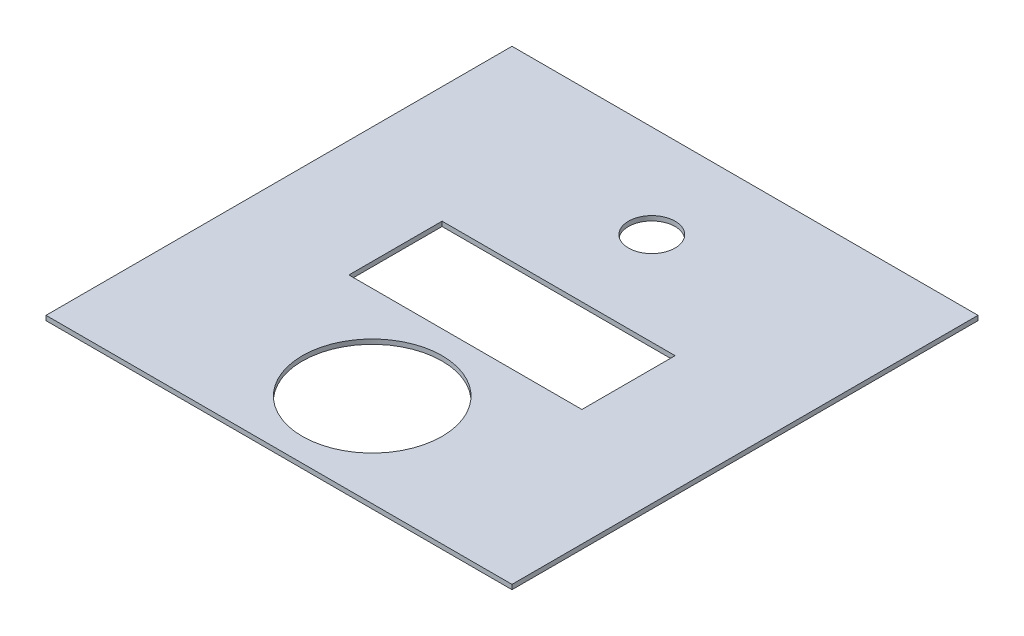
ISO-10303-21;
HEADER;
FILE_DESCRIPTION(('STEP AP214'),'2;1');
FILE_NAME('part.step','',(''),(''),'','','');
FILE_SCHEMA(('AUTOMOTIVE_DESIGN { 1 0 10303 214 1 1 1 1 }'));
ENDSEC;
DATA;
#1=APPLICATION_CONTEXT('core data for automotive mechanical design processes');
#2=APPLICATION_PROTOCOL_DEFINITION('international standard','automotive_design',2000,#1);
#3=PRODUCT_CONTEXT('',#1,'mechanical');
#4=PRODUCT('Part','Part','',(#3));
#5=PRODUCT_RELATED_PRODUCT_CATEGORY('part','',(#4));
#6=PRODUCT_DEFINITION_FORMATION('','',#4);
#7=PRODUCT_DEFINITION_CONTEXT('part definition',#1,'design');
#8=PRODUCT_DEFINITION('design','',#6,#7);
#9=PRODUCT_DEFINITION_SHAPE('','',#8);
#10=(LENGTH_UNIT() NAMED_UNIT(*) SI_UNIT(.MILLI.,.METRE.));
#11=(NAMED_UNIT(*) PLANE_ANGLE_UNIT() SI_UNIT($,.RADIAN.));
#12=(NAMED_UNIT(*) SI_UNIT($,.STERADIAN.) SOLID_ANGLE_UNIT());
#13=UNCERTAINTY_MEASURE_WITH_UNIT(LENGTH_MEASURE(1.E-05),#10,'distance_accuracy_value','');
#14=(GEOMETRIC_REPRESENTATION_CONTEXT(3) GLOBAL_UNCERTAINTY_ASSIGNED_CONTEXT((#13)) GLOBAL_UNIT_ASSIGNED_CONTEXT((#10,
#11,#12)) REPRESENTATION_CONTEXT('',''));
#15=CARTESIAN_POINT('',(0.,0.,0.));
#16=DIRECTION('',(0.,0.,1.));
#17=DIRECTION('',(1.,0.,0.));
#18=AXIS2_PLACEMENT_3D('',#15,#16,#17);
#19=CARTESIAN_POINT('',(50.,1.,50.));
#20=DIRECTION('',(-1.,0.,0.));
#21=DIRECTION('',(0.,0.,1.));
#22=AXIS2_PLACEMENT_3D('',#19,#20,#21);
#23=PLANE('',#22);
#24=DIRECTION('',(0.,0.,-1.));
#25=VECTOR('',#24,1.);
#26=CARTESIAN_POINT('',(50.,0.,50.));
#27=LINE('',#26,#25);
#28=CARTESIAN_POINT('',(50.,0.,50.));
#29=VERTEX_POINT('',#28);
#30=CARTESIAN_POINT('',(50.,0.,-50.));
#31=VERTEX_POINT('',#30);
#32=EDGE_CURVE('E134',#29,#31,#27,.T.);
#33=ORIENTED_EDGE('',*,*,#32,.T.);
#34=DIRECTION('',(0.,-1.,0.));
#35=VECTOR('',#34,1.);
#36=CARTESIAN_POINT('',(50.,1.,-50.));
#37=LINE('',#36,#35);
#38=CARTESIAN_POINT('',(50.,1.,-50.));
#39=VERTEX_POINT('',#38);
#40=EDGE_CURVE('E11',#39,#31,#37,.T.);
#41=ORIENTED_EDGE('',*,*,#40,.F.);
#42=DIRECTION('',(0.,0.,-1.));
#43=VECTOR('',#42,1.);
#44=CARTESIAN_POINT('',(50.,1.,50.));
#45=LINE('',#44,#43);
#46=CARTESIAN_POINT('',(50.,1.,50.));
#47=VERTEX_POINT('',#46);
#48=EDGE_CURVE('E138',#47,#39,#45,.T.);
#49=ORIENTED_EDGE('',*,*,#48,.F.);
#50=DIRECTION('',(0.,-1.,0.));
#51=VECTOR('',#50,1.);
#52=CARTESIAN_POINT('',(50.,1.,50.));
#53=LINE('',#52,#51);
#54=EDGE_CURVE('E148',#47,#29,#53,.T.);
#55=ORIENTED_EDGE('',*,*,#54,.T.);
#56=EDGE_LOOP('',(#33,#41,#49,#55));
#57=FACE_BOUND('',#56,.T.);
#58=ADVANCED_FACE('F33',(#57),#23,.F.);
#59=CARTESIAN_POINT('',(-50.,1.,-50.));
#60=DIRECTION('',(0.,0.,1.));
#61=DIRECTION('',(1.,0.,0.));
#62=AXIS2_PLACEMENT_3D('',#59,#60,#61);
#63=PLANE('',#62);
#64=DIRECTION('',(-1.,0.,0.));
#65=VECTOR('',#64,1.);
#66=CARTESIAN_POINT('',(-50.,0.,-50.));
#67=LINE('',#66,#65);
#68=CARTESIAN_POINT('',(-50.,0.,-50.));
#69=VERTEX_POINT('',#68);
#70=EDGE_CURVE('E151',#31,#69,#67,.T.);
#71=ORIENTED_EDGE('',*,*,#70,.T.);
#72=DIRECTION('',(0.,-1.,0.));
#73=VECTOR('',#72,1.);
#74=CARTESIAN_POINT('',(-50.,1.,-50.));
#75=LINE('',#74,#73);
#76=CARTESIAN_POINT('',(-50.,1.,-50.));
#77=VERTEX_POINT('',#76);
#78=EDGE_CURVE('E40',#77,#69,#75,.T.);
#79=ORIENTED_EDGE('',*,*,#78,.F.);
#80=DIRECTION('',(-1.,0.,0.));
#81=VECTOR('',#80,1.);
#82=CARTESIAN_POINT('',(-50.,1.,-50.));
#83=LINE('',#82,#81);
#84=EDGE_CURVE('E141',#39,#77,#83,.T.);
#85=ORIENTED_EDGE('',*,*,#84,.F.);
#86=ORIENTED_EDGE('',*,*,#40,.T.);
#87=EDGE_LOOP('',(#71,#79,#85,#86));
#88=FACE_BOUND('',#87,.T.);
#89=ADVANCED_FACE('F179',(#88),#63,.F.);
#90=CARTESIAN_POINT('',(-50.,1.,50.));
#91=DIRECTION('',(1.,0.,0.));
#92=DIRECTION('',(0.,0.,-1.));
#93=AXIS2_PLACEMENT_3D('',#90,#91,#92);
#94=PLANE('',#93);
#95=DIRECTION('',(0.,0.,1.));
#96=VECTOR('',#95,1.);
#97=CARTESIAN_POINT('',(-50.,0.,50.));
#98=LINE('',#97,#96);
#99=CARTESIAN_POINT('',(-50.,0.,50.));
#100=VERTEX_POINT('',#99);
#101=EDGE_CURVE('E153',#69,#100,#98,.T.);
#102=ORIENTED_EDGE('',*,*,#101,.T.);
#103=DIRECTION('',(0.,-1.,0.));
#104=VECTOR('',#103,1.);
#105=CARTESIAN_POINT('',(-50.,1.,50.));
#106=LINE('',#105,#104);
#107=CARTESIAN_POINT('',(-50.,1.,50.));
#108=VERTEX_POINT('',#107);
#109=EDGE_CURVE('E158',#108,#100,#106,.T.);
#110=ORIENTED_EDGE('',*,*,#109,.F.);
#111=DIRECTION('',(0.,0.,1.));
#112=VECTOR('',#111,1.);
#113=CARTESIAN_POINT('',(-50.,1.,50.));
#114=LINE('',#113,#112);
#115=EDGE_CURVE('E144',#77,#108,#114,.T.);
#116=ORIENTED_EDGE('',*,*,#115,.F.);
#117=ORIENTED_EDGE('',*,*,#78,.T.);
#118=EDGE_LOOP('',(#102,#110,#116,#117));
#119=FACE_BOUND('',#118,.T.);
#120=ADVANCED_FACE('F165',(#119),#94,.F.);
#121=CARTESIAN_POINT('',(-50.,1.,50.));
#122=DIRECTION('',(0.,0.,-1.));
#123=DIRECTION('',(-1.,0.,0.));
#124=AXIS2_PLACEMENT_3D('',#121,#122,#123);
#125=PLANE('',#124);
#126=DIRECTION('',(1.,0.,0.));
#127=VECTOR('',#126,1.);
#128=CARTESIAN_POINT('',(-50.,0.,50.));
#129=LINE('',#128,#127);
#130=EDGE_CURVE('E142',#100,#29,#129,.T.);
#131=ORIENTED_EDGE('',*,*,#130,.T.);
#132=ORIENTED_EDGE('',*,*,#54,.F.);
#133=DIRECTION('',(1.,0.,0.));
#134=VECTOR('',#133,1.);
#135=CARTESIAN_POINT('',(-50.,1.,50.));
#136=LINE('',#135,#134);
#137=EDGE_CURVE('E146',#108,#47,#136,.T.);
#138=ORIENTED_EDGE('',*,*,#137,.F.);
#139=ORIENTED_EDGE('',*,*,#109,.T.);
#140=EDGE_LOOP('',(#131,#132,#138,#139));
#141=FACE_BOUND('',#140,.T.);
#142=ADVANCED_FACE('F172',(#141),#125,.F.);
#143=CARTESIAN_POINT('',(0.,1.,0.));
#144=DIRECTION('',(0.,-1.,0.));
#145=DIRECTION('',(0.,0.,-1.));
#146=AXIS2_PLACEMENT_3D('',#143,#144,#145);
#147=PLANE('',#146);
#148=CARTESIAN_POINT('',(0.,1.,-30.));
#149=DIRECTION('',(0.,1.,0.));
#150=DIRECTION('',(0.,0.,1.));
#151=AXIS2_PLACEMENT_3D('',#148,#149,#150);
#152=CIRCLE('',#151,5.);
#153=CARTESIAN_POINT('',(0.,1.,-25.));
#154=VERTEX_POINT('',#153);
#155=EDGE_CURVE('E220',#154,#154,#152,.T.);
#156=ORIENTED_EDGE('',*,*,#155,.F.);
#157=EDGE_LOOP('',(#156));
#158=FACE_BOUND('',#157,.T.);
#159=CARTESIAN_POINT('',(0.,1.,30.));
#160=DIRECTION('',(0.,1.,0.));
#161=DIRECTION('',(0.,0.,1.));
#162=AXIS2_PLACEMENT_3D('',#159,#160,#161);
#163=CIRCLE('',#162,15.);
#164=CARTESIAN_POINT('',(0.,1.,45.));
#165=VERTEX_POINT('',#164);
#166=EDGE_CURVE('E121',#165,#165,#163,.T.);
#167=ORIENTED_EDGE('',*,*,#166,.F.);
#168=EDGE_LOOP('',(#167));
#169=FACE_BOUND('',#168,.T.);
#170=DIRECTION('',(-1.,0.,0.));
#171=VECTOR('',#170,1.);
#172=CARTESIAN_POINT('',(-25.,1.,-10.));
#173=LINE('',#172,#171);
#174=CARTESIAN_POINT('',(25.,1.,-10.));
#175=VERTEX_POINT('',#174);
#176=CARTESIAN_POINT('',(-25.,1.,-10.));
#177=VERTEX_POINT('',#176);
#178=EDGE_CURVE('E127',#175,#177,#173,.T.);
#179=ORIENTED_EDGE('',*,*,#178,.F.);
#180=DIRECTION('',(0.,0.,-1.));
#181=VECTOR('',#180,1.);
#182=CARTESIAN_POINT('',(25.,1.,10.));
#183=LINE('',#182,#181);
#184=CARTESIAN_POINT('',(25.,1.,10.));
#185=VERTEX_POINT('',#184);
#186=EDGE_CURVE('E47',#185,#175,#183,.T.);
#187=ORIENTED_EDGE('',*,*,#186,.F.);
#188=DIRECTION('',(1.,0.,0.));
#189=VECTOR('',#188,1.);
#190=CARTESIAN_POINT('',(-25.,1.,10.));
#191=LINE('',#190,#189);
#192=CARTESIAN_POINT('',(-25.,1.,10.));
#193=VERTEX_POINT('',#192);
#194=EDGE_CURVE('E115',#193,#185,#191,.T.);
#195=ORIENTED_EDGE('',*,*,#194,.F.);
#196=DIRECTION('',(0.,0.,1.));
#197=VECTOR('',#196,1.);
#198=CARTESIAN_POINT('',(-25.,1.,10.));
#199=LINE('',#198,#197);
#200=EDGE_CURVE('E118',#177,#193,#199,.T.);
#201=ORIENTED_EDGE('',*,*,#200,.F.);
#202=EDGE_LOOP('',(#179,#187,#195,#201));
#203=FACE_BOUND('',#202,.T.);
#204=ORIENTED_EDGE('',*,*,#48,.T.);
#205=ORIENTED_EDGE('',*,*,#84,.T.);
#206=ORIENTED_EDGE('',*,*,#115,.T.);
#207=ORIENTED_EDGE('',*,*,#137,.T.);
#208=EDGE_LOOP('',(#204,#205,#206,#207));
#209=FACE_BOUND('',#208,.T.);
#210=ADVANCED_FACE('F178',(#158,#169,#203,#209),#147,.F.);
#211=CARTESIAN_POINT('',(0.,0.,0.));
#212=DIRECTION('',(0.,-1.,0.));
#213=DIRECTION('',(0.,0.,-1.));
#214=AXIS2_PLACEMENT_3D('',#211,#212,#213);
#215=PLANE('',#214);
#216=CARTESIAN_POINT('',(0.,0.,-30.));
#217=DIRECTION('',(0.,1.,0.));
#218=DIRECTION('',(0.,0.,1.));
#219=AXIS2_PLACEMENT_3D('',#216,#217,#218);
#220=CIRCLE('',#219,5.);
#221=CARTESIAN_POINT('',(0.,0.,-25.));
#222=VERTEX_POINT('',#221);
#223=EDGE_CURVE('E128',#222,#222,#220,.T.);
#224=ORIENTED_EDGE('',*,*,#223,.T.);
#225=EDGE_LOOP('',(#224));
#226=FACE_BOUND('',#225,.T.);
#227=CARTESIAN_POINT('',(0.,0.,30.));
#228=DIRECTION('',(0.,1.,0.));
#229=DIRECTION('',(0.,0.,1.));
#230=AXIS2_PLACEMENT_3D('',#227,#228,#229);
#231=CIRCLE('',#230,15.);
#232=CARTESIAN_POINT('',(0.,0.,45.));
#233=VERTEX_POINT('',#232);
#234=EDGE_CURVE('E221',#233,#233,#231,.T.);
#235=ORIENTED_EDGE('',*,*,#234,.T.);
#236=EDGE_LOOP('',(#235));
#237=FACE_BOUND('',#236,.T.);
#238=DIRECTION('',(0.,0.,-1.));
#239=VECTOR('',#238,1.);
#240=CARTESIAN_POINT('',(25.,0.,10.));
#241=LINE('',#240,#239);
#242=CARTESIAN_POINT('',(25.,0.,10.));
#243=VERTEX_POINT('',#242);
#244=CARTESIAN_POINT('',(25.,0.,-10.));
#245=VERTEX_POINT('',#244);
#246=EDGE_CURVE('E99',#243,#245,#241,.T.);
#247=ORIENTED_EDGE('',*,*,#246,.T.);
#248=DIRECTION('',(-1.,0.,0.));
#249=VECTOR('',#248,1.);
#250=CARTESIAN_POINT('',(-25.,0.,-10.));
#251=LINE('',#250,#249);
#252=CARTESIAN_POINT('',(-25.,0.,-10.));
#253=VERTEX_POINT('',#252);
#254=EDGE_CURVE('E108',#245,#253,#251,.T.);
#255=ORIENTED_EDGE('',*,*,#254,.T.);
#256=DIRECTION('',(0.,0.,1.));
#257=VECTOR('',#256,1.);
#258=CARTESIAN_POINT('',(-25.,0.,10.));
#259=LINE('',#258,#257);
#260=CARTESIAN_POINT('',(-25.,0.,10.));
#261=VERTEX_POINT('',#260);
#262=EDGE_CURVE('E55',#253,#261,#259,.T.);
#263=ORIENTED_EDGE('',*,*,#262,.T.);
#264=DIRECTION('',(1.,0.,0.));
#265=VECTOR('',#264,1.);
#266=CARTESIAN_POINT('',(-25.,0.,10.));
#267=LINE('',#266,#265);
#268=EDGE_CURVE('E105',#261,#243,#267,.T.);
#269=ORIENTED_EDGE('',*,*,#268,.T.);
#270=EDGE_LOOP('',(#247,#255,#263,#269));
#271=FACE_BOUND('',#270,.T.);
#272=ORIENTED_EDGE('',*,*,#32,.F.);
#273=ORIENTED_EDGE('',*,*,#130,.F.);
#274=ORIENTED_EDGE('',*,*,#101,.F.);
#275=ORIENTED_EDGE('',*,*,#70,.F.);
#276=EDGE_LOOP('',(#272,#273,#274,#275));
#277=FACE_BOUND('',#276,.T.);
#278=ADVANCED_FACE('F112',(#226,#237,#271,#277),#215,.T.);
#279=CARTESIAN_POINT('',(25.,0.,10.));
#280=DIRECTION('',(1.,0.,0.));
#281=DIRECTION('',(0.,0.,-1.));
#282=AXIS2_PLACEMENT_3D('',#279,#280,#281);
#283=PLANE('',#282);
#284=ORIENTED_EDGE('',*,*,#186,.T.);
#285=DIRECTION('',(0.,1.,0.));
#286=VECTOR('',#285,1.);
#287=CARTESIAN_POINT('',(25.,0.,-10.));
#288=LINE('',#287,#286);
#289=EDGE_CURVE('E95',#245,#175,#288,.T.);
#290=ORIENTED_EDGE('',*,*,#289,.F.);
#291=ORIENTED_EDGE('',*,*,#246,.F.);
#292=DIRECTION('',(0.,1.,0.));
#293=VECTOR('',#292,1.);
#294=CARTESIAN_POINT('',(25.,0.,10.));
#295=LINE('',#294,#293);
#296=EDGE_CURVE('E132',#243,#185,#295,.T.);
#297=ORIENTED_EDGE('',*,*,#296,.T.);
#298=EDGE_LOOP('',(#284,#290,#291,#297));
#299=FACE_BOUND('',#298,.T.);
#300=ADVANCED_FACE('F97',(#299),#283,.F.);
#301=CARTESIAN_POINT('',(-25.,0.,10.));
#302=DIRECTION('',(0.,0.,1.));
#303=DIRECTION('',(1.,0.,0.));
#304=AXIS2_PLACEMENT_3D('',#301,#302,#303);
#305=PLANE('',#304);
#306=ORIENTED_EDGE('',*,*,#194,.T.);
#307=ORIENTED_EDGE('',*,*,#296,.F.);
#308=ORIENTED_EDGE('',*,*,#268,.F.);
#309=DIRECTION('',(0.,1.,0.));
#310=VECTOR('',#309,1.);
#311=CARTESIAN_POINT('',(-25.,0.,10.));
#312=LINE('',#311,#310);
#313=EDGE_CURVE('E135',#261,#193,#312,.T.);
#314=ORIENTED_EDGE('',*,*,#313,.T.);
#315=EDGE_LOOP('',(#306,#307,#308,#314));
#316=FACE_BOUND('',#315,.T.);
#317=ADVANCED_FACE('F197',(#316),#305,.F.);
#318=CARTESIAN_POINT('',(-25.,0.,10.));
#319=DIRECTION('',(-1.,0.,0.));
#320=DIRECTION('',(0.,0.,1.));
#321=AXIS2_PLACEMENT_3D('',#318,#319,#320);
#322=PLANE('',#321);
#323=ORIENTED_EDGE('',*,*,#200,.T.);
#324=ORIENTED_EDGE('',*,*,#313,.F.);
#325=ORIENTED_EDGE('',*,*,#262,.F.);
#326=DIRECTION('',(0.,1.,0.));
#327=VECTOR('',#326,1.);
#328=CARTESIAN_POINT('',(-25.,0.,-10.));
#329=LINE('',#328,#327);
#330=EDGE_CURVE('E104',#253,#177,#329,.T.);
#331=ORIENTED_EDGE('',*,*,#330,.T.);
#332=EDGE_LOOP('',(#323,#324,#325,#331));
#333=FACE_BOUND('',#332,.T.);
#334=ADVANCED_FACE('F201',(#333),#322,.F.);
#335=CARTESIAN_POINT('',(-25.,0.,-10.));
#336=DIRECTION('',(0.,0.,-1.));
#337=DIRECTION('',(-1.,0.,0.));
#338=AXIS2_PLACEMENT_3D('',#335,#336,#337);
#339=PLANE('',#338);
#340=ORIENTED_EDGE('',*,*,#178,.T.);
#341=ORIENTED_EDGE('',*,*,#330,.F.);
#342=ORIENTED_EDGE('',*,*,#254,.F.);
#343=ORIENTED_EDGE('',*,*,#289,.T.);
#344=EDGE_LOOP('',(#340,#341,#342,#343));
#345=FACE_BOUND('',#344,.T.);
#346=ADVANCED_FACE('F109',(#345),#339,.F.);
#347=CARTESIAN_POINT('',(0.,0.,30.));
#348=DIRECTION('',(0.,1.,0.));
#349=DIRECTION('',(0.,0.,1.));
#350=AXIS2_PLACEMENT_3D('',#347,#348,#349);
#351=CYLINDRICAL_SURFACE('',#350,15.);
#352=ORIENTED_EDGE('',*,*,#234,.F.);
#353=EDGE_LOOP('',(#352));
#354=FACE_BOUND('',#353,.T.);
#355=ORIENTED_EDGE('',*,*,#166,.T.);
#356=EDGE_LOOP('',(#355));
#357=FACE_BOUND('',#356,.T.);
#358=ADVANCED_FACE('F200',(#354,#357),#351,.F.);
#359=CARTESIAN_POINT('',(0.,0.,-30.));
#360=DIRECTION('',(0.,1.,0.));
#361=DIRECTION('',(0.,0.,1.));
#362=AXIS2_PLACEMENT_3D('',#359,#360,#361);
#363=CYLINDRICAL_SURFACE('',#362,5.);
#364=ORIENTED_EDGE('',*,*,#223,.F.);
#365=EDGE_LOOP('',(#364));
#366=FACE_BOUND('',#365,.T.);
#367=ORIENTED_EDGE('',*,*,#155,.T.);
#368=EDGE_LOOP('',(#367));
#369=FACE_BOUND('',#368,.T.);
#370=ADVANCED_FACE('F209',(#366,#369),#363,.F.);
#371=CLOSED_SHELL('',(#58,#89,#120,#142,#210,#278,#300,#317,#334,#346,#358,#370));
#372=MANIFOLD_SOLID_BREP('B2',#371);
#373=ADVANCED_BREP_SHAPE_REPRESENTATION('',(#18,#372),#14);
#374=SHAPE_DEFINITION_REPRESENTATION(#9,#373);
ENDSEC;
END-ISO-10303-21;
